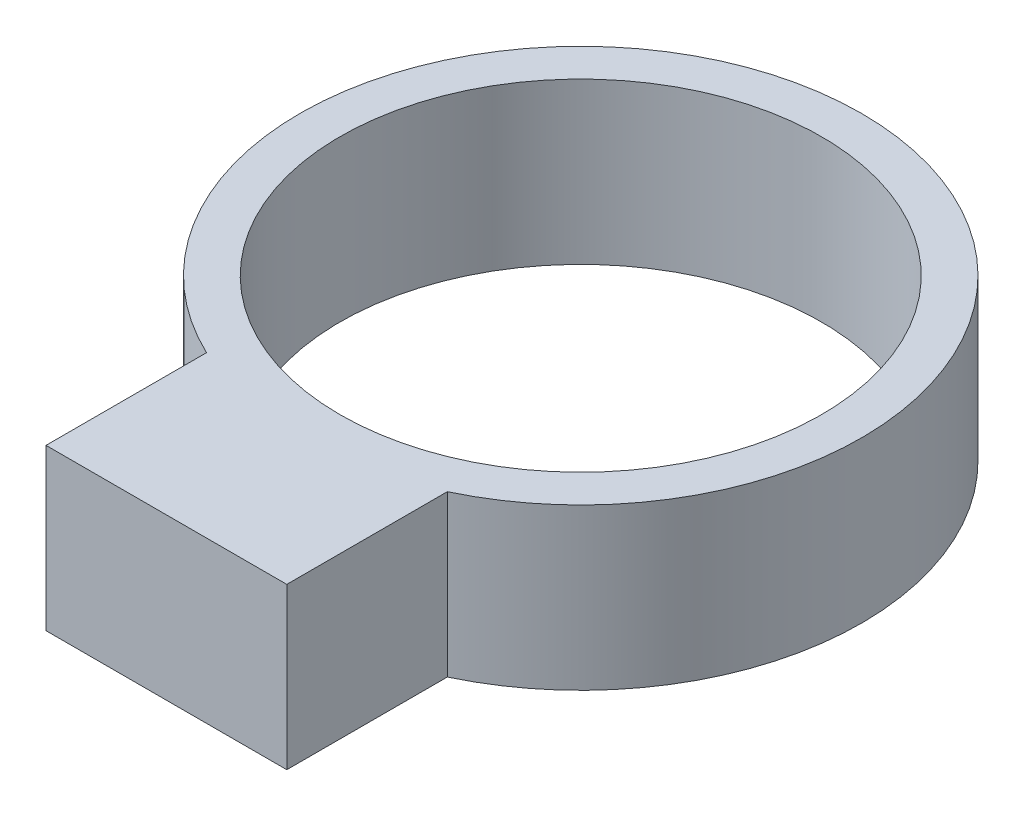
ISO-10303-21;
HEADER;
FILE_DESCRIPTION(('STEP AP214'),'2;1');
FILE_NAME('part.step','',(''),(''),'','','');
FILE_SCHEMA(('AUTOMOTIVE_DESIGN { 1 0 10303 214 1 1 1 1 }'));
ENDSEC;
DATA;
#1=APPLICATION_CONTEXT('core data for automotive mechanical design processes');
#2=APPLICATION_PROTOCOL_DEFINITION('international standard','automotive_design',2000,#1);
#3=PRODUCT_CONTEXT('',#1,'mechanical');
#4=PRODUCT('Part','Part','',(#3));
#5=PRODUCT_RELATED_PRODUCT_CATEGORY('part','',(#4));
#6=PRODUCT_DEFINITION_FORMATION('','',#4);
#7=PRODUCT_DEFINITION_CONTEXT('part definition',#1,'design');
#8=PRODUCT_DEFINITION('design','',#6,#7);
#9=PRODUCT_DEFINITION_SHAPE('','',#8);
#10=(LENGTH_UNIT() NAMED_UNIT(*) SI_UNIT(.MILLI.,.METRE.));
#11=(NAMED_UNIT(*) PLANE_ANGLE_UNIT() SI_UNIT($,.RADIAN.));
#12=(NAMED_UNIT(*) SI_UNIT($,.STERADIAN.) SOLID_ANGLE_UNIT());
#13=UNCERTAINTY_MEASURE_WITH_UNIT(LENGTH_MEASURE(1.E-05),#10,'distance_accuracy_value','');
#14=(GEOMETRIC_REPRESENTATION_CONTEXT(3) GLOBAL_UNCERTAINTY_ASSIGNED_CONTEXT((#13)) GLOBAL_UNIT_ASSIGNED_CONTEXT((#10,
#11,#12)) REPRESENTATION_CONTEXT('',''));
#15=CARTESIAN_POINT('',(0.,0.,0.));
#16=DIRECTION('',(0.,0.,1.));
#17=DIRECTION('',(1.,0.,0.));
#18=AXIS2_PLACEMENT_3D('',#15,#16,#17);
#19=CARTESIAN_POINT('',(0.,10.,0.));
#20=DIRECTION('',(0.,1.,0.));
#21=DIRECTION('',(0.,0.,1.));
#22=AXIS2_PLACEMENT_3D('',#19,#20,#21);
#23=PLANE('',#22);
#24=DIRECTION('',(0.,0.,1.));
#25=VECTOR('',#24,1.);
#26=CARTESIAN_POINT('',(-7.5,10.,25.8113883008419));
#27=LINE('',#26,#25);
#28=CARTESIAN_POINT('',(-7.5,10.,15.8113883008419));
#29=VERTEX_POINT('',#28);
#30=CARTESIAN_POINT('',(-7.5,10.,25.8113883008419));
#31=VERTEX_POINT('',#30);
#32=EDGE_CURVE('E92',#29,#31,#27,.T.);
#33=ORIENTED_EDGE('',*,*,#32,.T.);
#34=DIRECTION('',(1.,0.,0.));
#35=VECTOR('',#34,1.);
#36=CARTESIAN_POINT('',(-7.5,10.,25.8113883008419));
#37=LINE('',#36,#35);
#38=CARTESIAN_POINT('',(7.5,10.,25.8113883008419));
#39=VERTEX_POINT('',#38);
#40=EDGE_CURVE('E87',#31,#39,#37,.T.);
#41=ORIENTED_EDGE('',*,*,#40,.T.);
#42=DIRECTION('',(0.,0.,-1.));
#43=VECTOR('',#42,1.);
#44=CARTESIAN_POINT('',(7.5,10.,25.8113883008419));
#45=LINE('',#44,#43);
#46=CARTESIAN_POINT('',(7.5,10.,15.8113883008419));
#47=VERTEX_POINT('',#46);
#48=EDGE_CURVE('E90',#39,#47,#45,.T.);
#49=ORIENTED_EDGE('',*,*,#48,.T.);
#50=CARTESIAN_POINT('',(0.,10.,0.));
#51=DIRECTION('',(0.,1.,0.));
#52=DIRECTION('',(0.,0.,1.));
#53=AXIS2_PLACEMENT_3D('',#50,#51,#52);
#54=CIRCLE('',#53,17.5);
#55=EDGE_CURVE('E57',#47,#29,#54,.T.);
#56=ORIENTED_EDGE('',*,*,#55,.T.);
#57=EDGE_LOOP('',(#33,#41,#49,#56));
#58=FACE_BOUND('',#57,.T.);
#59=CARTESIAN_POINT('',(0.,10.,0.));
#60=DIRECTION('',(0.,1.,0.));
#61=DIRECTION('',(0.,0.,1.));
#62=AXIS2_PLACEMENT_3D('',#59,#60,#61);
#63=CIRCLE('',#62,15.);
#64=CARTESIAN_POINT('',(0.,10.,15.));
#65=VERTEX_POINT('',#64);
#66=EDGE_CURVE('E112',#65,#65,#63,.T.);
#67=ORIENTED_EDGE('',*,*,#66,.F.);
#68=EDGE_LOOP('',(#67));
#69=FACE_BOUND('',#68,.T.);
#70=ADVANCED_FACE('F39',(#58,#69),#23,.T.);
#71=CARTESIAN_POINT('',(0.,0.,0.));
#72=DIRECTION('',(0.,1.,0.));
#73=DIRECTION('',(0.,0.,1.));
#74=AXIS2_PLACEMENT_3D('',#71,#72,#73);
#75=PLANE('',#74);
#76=DIRECTION('',(0.,0.,1.));
#77=VECTOR('',#76,1.);
#78=CARTESIAN_POINT('',(-7.5,0.,25.8113883008419));
#79=LINE('',#78,#77);
#80=CARTESIAN_POINT('',(-7.5,0.,15.8113883008419));
#81=VERTEX_POINT('',#80);
#82=CARTESIAN_POINT('',(-7.5,0.,25.8113883008419));
#83=VERTEX_POINT('',#82);
#84=EDGE_CURVE('E108',#81,#83,#79,.T.);
#85=ORIENTED_EDGE('',*,*,#84,.F.);
#86=CARTESIAN_POINT('',(0.,0.,0.));
#87=DIRECTION('',(0.,1.,0.));
#88=DIRECTION('',(0.,0.,1.));
#89=AXIS2_PLACEMENT_3D('',#86,#87,#88);
#90=CIRCLE('',#89,17.5);
#91=CARTESIAN_POINT('',(7.5,0.,15.8113883008419));
#92=VERTEX_POINT('',#91);
#93=EDGE_CURVE('E80',#92,#81,#90,.T.);
#94=ORIENTED_EDGE('',*,*,#93,.F.);
#95=DIRECTION('',(0.,0.,-1.));
#96=VECTOR('',#95,1.);
#97=CARTESIAN_POINT('',(7.5,0.,25.8113883008419));
#98=LINE('',#97,#96);
#99=CARTESIAN_POINT('',(7.5,0.,25.8113883008419));
#100=VERTEX_POINT('',#99);
#101=EDGE_CURVE('E74',#100,#92,#98,.T.);
#102=ORIENTED_EDGE('',*,*,#101,.F.);
#103=DIRECTION('',(1.,0.,0.));
#104=VECTOR('',#103,1.);
#105=CARTESIAN_POINT('',(-7.5,0.,25.8113883008419));
#106=LINE('',#105,#104);
#107=EDGE_CURVE('E97',#83,#100,#106,.T.);
#108=ORIENTED_EDGE('',*,*,#107,.F.);
#109=EDGE_LOOP('',(#85,#94,#102,#108));
#110=FACE_BOUND('',#109,.T.);
#111=CARTESIAN_POINT('',(0.,0.,0.));
#112=DIRECTION('',(0.,1.,0.));
#113=DIRECTION('',(0.,0.,1.));
#114=AXIS2_PLACEMENT_3D('',#111,#112,#113);
#115=CIRCLE('',#114,15.);
#116=CARTESIAN_POINT('',(0.,0.,15.));
#117=VERTEX_POINT('',#116);
#118=EDGE_CURVE('E130',#117,#117,#115,.T.);
#119=ORIENTED_EDGE('',*,*,#118,.T.);
#120=EDGE_LOOP('',(#119));
#121=FACE_BOUND('',#120,.T.);
#122=ADVANCED_FACE('F125',(#110,#121),#75,.F.);
#123=CARTESIAN_POINT('',(-7.5,10.,25.8113883008419));
#124=DIRECTION('',(1.,0.,0.));
#125=DIRECTION('',(0.,0.,-1.));
#126=AXIS2_PLACEMENT_3D('',#123,#124,#125);
#127=PLANE('',#126);
#128=ORIENTED_EDGE('',*,*,#84,.T.);
#129=DIRECTION('',(0.,-1.,0.));
#130=VECTOR('',#129,1.);
#131=CARTESIAN_POINT('',(-7.5,10.,25.8113883008419));
#132=LINE('',#131,#130);
#133=EDGE_CURVE('E11',#31,#83,#132,.T.);
#134=ORIENTED_EDGE('',*,*,#133,.F.);
#135=ORIENTED_EDGE('',*,*,#32,.F.);
#136=DIRECTION('',(0.,-1.,0.));
#137=VECTOR('',#136,1.);
#138=CARTESIAN_POINT('',(-7.5,10.,15.8113883008419));
#139=LINE('',#138,#137);
#140=EDGE_CURVE('E104',#29,#81,#139,.T.);
#141=ORIENTED_EDGE('',*,*,#140,.T.);
#142=EDGE_LOOP('',(#128,#134,#135,#141));
#143=FACE_BOUND('',#142,.T.);
#144=ADVANCED_FACE('F41',(#143),#127,.F.);
#145=CARTESIAN_POINT('',(-7.5,10.,25.8113883008419));
#146=DIRECTION('',(0.,0.,-1.));
#147=DIRECTION('',(-1.,0.,0.));
#148=AXIS2_PLACEMENT_3D('',#145,#146,#147);
#149=PLANE('',#148);
#150=ORIENTED_EDGE('',*,*,#107,.T.);
#151=DIRECTION('',(0.,-1.,0.));
#152=VECTOR('',#151,1.);
#153=CARTESIAN_POINT('',(7.5,10.,25.8113883008419));
#154=LINE('',#153,#152);
#155=EDGE_CURVE('E49',#39,#100,#154,.T.);
#156=ORIENTED_EDGE('',*,*,#155,.F.);
#157=ORIENTED_EDGE('',*,*,#40,.F.);
#158=ORIENTED_EDGE('',*,*,#133,.T.);
#159=EDGE_LOOP('',(#150,#156,#157,#158));
#160=FACE_BOUND('',#159,.T.);
#161=ADVANCED_FACE('F96',(#160),#149,.F.);
#162=CARTESIAN_POINT('',(7.5,10.,25.8113883008419));
#163=DIRECTION('',(-1.,0.,0.));
#164=DIRECTION('',(0.,0.,1.));
#165=AXIS2_PLACEMENT_3D('',#162,#163,#164);
#166=PLANE('',#165);
#167=ORIENTED_EDGE('',*,*,#101,.T.);
#168=DIRECTION('',(0.,-1.,0.));
#169=VECTOR('',#168,1.);
#170=CARTESIAN_POINT('',(7.5,10.,15.8113883008419));
#171=LINE('',#170,#169);
#172=EDGE_CURVE('E99',#47,#92,#171,.T.);
#173=ORIENTED_EDGE('',*,*,#172,.F.);
#174=ORIENTED_EDGE('',*,*,#48,.F.);
#175=ORIENTED_EDGE('',*,*,#155,.T.);
#176=EDGE_LOOP('',(#167,#173,#174,#175));
#177=FACE_BOUND('',#176,.T.);
#178=ADVANCED_FACE('F100',(#177),#166,.F.);
#179=CARTESIAN_POINT('',(0.,10.,0.));
#180=DIRECTION('',(0.,-1.,0.));
#181=DIRECTION('',(0.,0.,-1.));
#182=AXIS2_PLACEMENT_3D('',#179,#180,#181);
#183=CYLINDRICAL_SURFACE('',#182,17.5);
#184=ORIENTED_EDGE('',*,*,#93,.T.);
#185=ORIENTED_EDGE('',*,*,#140,.F.);
#186=ORIENTED_EDGE('',*,*,#55,.F.);
#187=ORIENTED_EDGE('',*,*,#172,.T.);
#188=EDGE_LOOP('',(#184,#185,#186,#187));
#189=FACE_BOUND('',#188,.T.);
#190=ADVANCED_FACE('F122',(#189),#183,.T.);
#191=CARTESIAN_POINT('',(0.,10.,0.));
#192=DIRECTION('',(0.,-1.,0.));
#193=DIRECTION('',(0.,0.,-1.));
#194=AXIS2_PLACEMENT_3D('',#191,#192,#193);
#195=CYLINDRICAL_SURFACE('',#194,15.);
#196=ORIENTED_EDGE('',*,*,#66,.T.);
#197=EDGE_LOOP('',(#196));
#198=FACE_BOUND('',#197,.T.);
#199=ORIENTED_EDGE('',*,*,#118,.F.);
#200=EDGE_LOOP('',(#199));
#201=FACE_BOUND('',#200,.T.);
#202=ADVANCED_FACE('F138',(#198,#201),#195,.F.);
#203=CLOSED_SHELL('',(#70,#122,#144,#161,#178,#190,#202));
#204=MANIFOLD_SOLID_BREP('B2',#203);
#205=ADVANCED_BREP_SHAPE_REPRESENTATION('',(#18,#204),#14);
#206=SHAPE_DEFINITION_REPRESENTATION(#9,#205);
ENDSEC;
END-ISO-10303-21;
